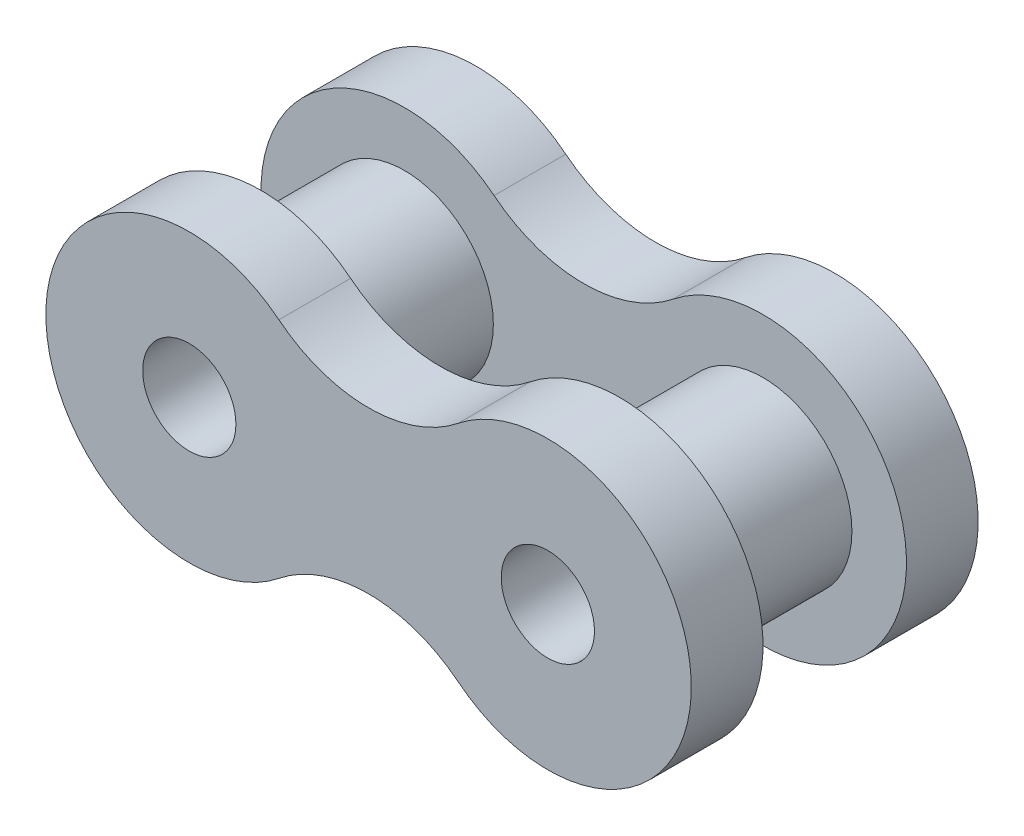
ISO-10303-21;
HEADER;
FILE_DESCRIPTION(('STEP AP214'),'2;1');
FILE_NAME('part.step','',(''),(''),'','','');
FILE_SCHEMA(('AUTOMOTIVE_DESIGN { 1 0 10303 214 1 1 1 1 }'));
ENDSEC;
DATA;
#1=APPLICATION_CONTEXT('core data for automotive mechanical design processes');
#2=APPLICATION_PROTOCOL_DEFINITION('international standard','automotive_design',2000,#1);
#3=PRODUCT_CONTEXT('',#1,'mechanical');
#4=PRODUCT('Part','Part','',(#3));
#5=PRODUCT_RELATED_PRODUCT_CATEGORY('part','',(#4));
#6=PRODUCT_DEFINITION_FORMATION('','',#4);
#7=PRODUCT_DEFINITION_CONTEXT('part definition',#1,'design');
#8=PRODUCT_DEFINITION('design','',#6,#7);
#9=PRODUCT_DEFINITION_SHAPE('','',#8);
#10=(LENGTH_UNIT() NAMED_UNIT(*) SI_UNIT(.MILLI.,.METRE.));
#11=(NAMED_UNIT(*) PLANE_ANGLE_UNIT() SI_UNIT($,.RADIAN.));
#12=(NAMED_UNIT(*) SI_UNIT($,.STERADIAN.) SOLID_ANGLE_UNIT());
#13=UNCERTAINTY_MEASURE_WITH_UNIT(LENGTH_MEASURE(1.E-05),#10,'distance_accuracy_value','');
#14=(GEOMETRIC_REPRESENTATION_CONTEXT(3) GLOBAL_UNCERTAINTY_ASSIGNED_CONTEXT((#13)) GLOBAL_UNIT_ASSIGNED_CONTEXT((#10,
#11,#12)) REPRESENTATION_CONTEXT('',''));
#15=CARTESIAN_POINT('',(0.,0.,0.));
#16=DIRECTION('',(0.,0.,1.));
#17=DIRECTION('',(1.,0.,0.));
#18=AXIS2_PLACEMENT_3D('',#15,#16,#17);
#19=CARTESIAN_POINT('',(3.175,0.,1.27));
#20=DIRECTION('',(0.,0.,-1.));
#21=DIRECTION('',(-1.,0.,0.));
#22=AXIS2_PLACEMENT_3D('',#19,#20,#21);
#23=CYLINDRICAL_SURFACE('',#22,1.5748);
#24=CARTESIAN_POINT('',(3.175,0.,1.27));
#25=DIRECTION('',(0.,0.,1.));
#26=DIRECTION('',(1.,0.,0.));
#27=AXIS2_PLACEMENT_3D('',#24,#25,#26);
#28=CIRCLE('',#27,1.5748);
#29=CARTESIAN_POINT('',(4.7498,0.,1.27));
#30=VERTEX_POINT('',#29);
#31=EDGE_CURVE('E48',#30,#30,#28,.T.);
#32=ORIENTED_EDGE('',*,*,#31,.F.);
#33=EDGE_LOOP('',(#32));
#34=FACE_BOUND('',#33,.T.);
#35=CARTESIAN_POINT('',(3.175,0.,-1.27));
#36=DIRECTION('',(0.,0.,1.));
#37=DIRECTION('',(1.,0.,0.));
#38=AXIS2_PLACEMENT_3D('',#35,#36,#37);
#39=CIRCLE('',#38,1.5748);
#40=CARTESIAN_POINT('',(4.7498,0.,-1.27));
#41=VERTEX_POINT('',#40);
#42=EDGE_CURVE('E175',#41,#41,#39,.T.);
#43=ORIENTED_EDGE('',*,*,#42,.T.);
#44=EDGE_LOOP('',(#43));
#45=FACE_BOUND('',#44,.T.);
#46=ADVANCED_FACE('F39',(#34,#45),#23,.T.);
#47=CARTESIAN_POINT('',(0.,3.96557372898298,2.54));
#48=DIRECTION('',(0.,0.,-1.));
#49=DIRECTION('',(-1.,0.,0.));
#50=AXIS2_PLACEMENT_3D('',#47,#48,#49);
#51=CYLINDRICAL_SURFACE('',#50,2.54);
#52=CARTESIAN_POINT('',(0.,3.96557372898298,1.27));
#53=DIRECTION('',(0.,0.,-1.));
#54=DIRECTION('',(1.,0.,0.));
#55=AXIS2_PLACEMENT_3D('',#52,#53,#54);
#56=CIRCLE('',#55,2.54);
#57=CARTESIAN_POINT('',(1.5875,1.98278686449149,1.27));
#58=VERTEX_POINT('',#57);
#59=CARTESIAN_POINT('',(-1.5875,1.98278686449149,1.27));
#60=VERTEX_POINT('',#59);
#61=EDGE_CURVE('E187',#58,#60,#56,.T.);
#62=ORIENTED_EDGE('',*,*,#61,.T.);
#63=DIRECTION('',(0.,0.,-1.));
#64=VECTOR('',#63,1.);
#65=CARTESIAN_POINT('',(-1.5875,1.98278686449149,2.54));
#66=LINE('',#65,#64);
#67=CARTESIAN_POINT('',(-1.5875,1.98278686449149,2.54));
#68=VERTEX_POINT('',#67);
#69=EDGE_CURVE('E206',#68,#60,#66,.T.);
#70=ORIENTED_EDGE('',*,*,#69,.F.);
#71=CARTESIAN_POINT('',(0.,3.96557372898298,2.54));
#72=DIRECTION('',(0.,0.,-1.));
#73=DIRECTION('',(1.,0.,0.));
#74=AXIS2_PLACEMENT_3D('',#71,#72,#73);
#75=CIRCLE('',#74,2.54);
#76=CARTESIAN_POINT('',(1.5875,1.98278686449149,2.54));
#77=VERTEX_POINT('',#76);
#78=EDGE_CURVE('E176',#77,#68,#75,.T.);
#79=ORIENTED_EDGE('',*,*,#78,.F.);
#80=DIRECTION('',(0.,0.,-1.));
#81=VECTOR('',#80,1.);
#82=CARTESIAN_POINT('',(1.5875,1.98278686449149,2.54));
#83=LINE('',#82,#81);
#84=EDGE_CURVE('E186',#77,#58,#83,.T.);
#85=ORIENTED_EDGE('',*,*,#84,.T.);
#86=EDGE_LOOP('',(#62,#70,#79,#85));
#87=FACE_BOUND('',#86,.T.);
#88=ADVANCED_FACE('F238',(#87),#51,.F.);
#89=CARTESIAN_POINT('',(-3.175,0.,2.54));
#90=DIRECTION('',(0.,0.,-1.));
#91=DIRECTION('',(-1.,0.,0.));
#92=AXIS2_PLACEMENT_3D('',#89,#90,#91);
#93=CYLINDRICAL_SURFACE('',#92,2.54);
#94=CARTESIAN_POINT('',(-3.175,0.,1.27));
#95=DIRECTION('',(0.,0.,1.));
#96=DIRECTION('',(1.,0.,0.));
#97=AXIS2_PLACEMENT_3D('',#94,#95,#96);
#98=CIRCLE('',#97,2.54);
#99=CARTESIAN_POINT('',(-1.5875,-1.98278686449149,1.27));
#100=VERTEX_POINT('',#99);
#101=EDGE_CURVE('E191',#60,#100,#98,.T.);
#102=ORIENTED_EDGE('',*,*,#101,.T.);
#103=DIRECTION('',(0.,0.,-1.));
#104=VECTOR('',#103,1.);
#105=CARTESIAN_POINT('',(-1.5875,-1.98278686449149,2.54));
#106=LINE('',#105,#104);
#107=CARTESIAN_POINT('',(-1.5875,-1.98278686449149,2.54));
#108=VERTEX_POINT('',#107);
#109=EDGE_CURVE('E203',#108,#100,#106,.T.);
#110=ORIENTED_EDGE('',*,*,#109,.F.);
#111=CARTESIAN_POINT('',(-3.175,0.,2.54));
#112=DIRECTION('',(0.,0.,1.));
#113=DIRECTION('',(1.,0.,0.));
#114=AXIS2_PLACEMENT_3D('',#111,#112,#113);
#115=CIRCLE('',#114,2.54);
#116=EDGE_CURVE('E88',#68,#108,#115,.T.);
#117=ORIENTED_EDGE('',*,*,#116,.F.);
#118=ORIENTED_EDGE('',*,*,#69,.T.);
#119=EDGE_LOOP('',(#102,#110,#117,#118));
#120=FACE_BOUND('',#119,.T.);
#121=ADVANCED_FACE('F243',(#120),#93,.T.);
#122=CARTESIAN_POINT('',(0.,-3.96557372898298,2.54));
#123=DIRECTION('',(0.,0.,-1.));
#124=DIRECTION('',(-1.,0.,0.));
#125=AXIS2_PLACEMENT_3D('',#122,#123,#124);
#126=CYLINDRICAL_SURFACE('',#125,2.54);
#127=CARTESIAN_POINT('',(0.,-3.96557372898298,1.27));
#128=DIRECTION('',(0.,0.,-1.));
#129=DIRECTION('',(1.,0.,0.));
#130=AXIS2_PLACEMENT_3D('',#127,#128,#129);
#131=CIRCLE('',#130,2.54);
#132=CARTESIAN_POINT('',(1.5875,-1.98278686449149,1.27));
#133=VERTEX_POINT('',#132);
#134=EDGE_CURVE('E74',#100,#133,#131,.T.);
#135=ORIENTED_EDGE('',*,*,#134,.T.);
#136=DIRECTION('',(0.,0.,-1.));
#137=VECTOR('',#136,1.);
#138=CARTESIAN_POINT('',(1.5875,-1.98278686449149,2.54));
#139=LINE('',#138,#137);
#140=CARTESIAN_POINT('',(1.5875,-1.98278686449149,2.54));
#141=VERTEX_POINT('',#140);
#142=EDGE_CURVE('E200',#141,#133,#139,.T.);
#143=ORIENTED_EDGE('',*,*,#142,.F.);
#144=CARTESIAN_POINT('',(0.,-3.96557372898298,2.54));
#145=DIRECTION('',(0.,0.,-1.));
#146=DIRECTION('',(1.,0.,0.));
#147=AXIS2_PLACEMENT_3D('',#144,#145,#146);
#148=CIRCLE('',#147,2.54);
#149=EDGE_CURVE('E181',#108,#141,#148,.T.);
#150=ORIENTED_EDGE('',*,*,#149,.F.);
#151=ORIENTED_EDGE('',*,*,#109,.T.);
#152=EDGE_LOOP('',(#135,#143,#150,#151));
#153=FACE_BOUND('',#152,.T.);
#154=ADVANCED_FACE('F259',(#153),#126,.F.);
#155=CARTESIAN_POINT('',(3.175,0.,2.54));
#156=DIRECTION('',(0.,0.,-1.));
#157=DIRECTION('',(-1.,0.,0.));
#158=AXIS2_PLACEMENT_3D('',#155,#156,#157);
#159=CYLINDRICAL_SURFACE('',#158,2.54);
#160=CARTESIAN_POINT('',(3.175,0.,1.27));
#161=DIRECTION('',(0.,0.,1.));
#162=DIRECTION('',(1.,0.,0.));
#163=AXIS2_PLACEMENT_3D('',#160,#161,#162);
#164=CIRCLE('',#163,2.54);
#165=EDGE_CURVE('E80',#133,#58,#164,.T.);
#166=ORIENTED_EDGE('',*,*,#165,.T.);
#167=ORIENTED_EDGE('',*,*,#84,.F.);
#168=CARTESIAN_POINT('',(3.175,0.,2.54));
#169=DIRECTION('',(0.,0.,1.));
#170=DIRECTION('',(1.,0.,0.));
#171=AXIS2_PLACEMENT_3D('',#168,#169,#170);
#172=CIRCLE('',#171,2.54);
#173=EDGE_CURVE('E56',#141,#77,#172,.T.);
#174=ORIENTED_EDGE('',*,*,#173,.F.);
#175=ORIENTED_EDGE('',*,*,#142,.T.);
#176=EDGE_LOOP('',(#166,#167,#174,#175));
#177=FACE_BOUND('',#176,.T.);
#178=ADVANCED_FACE('F257',(#177),#159,.T.);
#179=CARTESIAN_POINT('',(1.5875,1.98278686449149,2.54));
#180=DIRECTION('',(0.,0.,1.));
#181=DIRECTION('',(1.,0.,0.));
#182=AXIS2_PLACEMENT_3D('',#179,#180,#181);
#183=PLANE('',#182);
#184=CARTESIAN_POINT('',(3.175,0.,2.54));
#185=DIRECTION('',(0.,0.,1.));
#186=DIRECTION('',(1.,0.,0.));
#187=AXIS2_PLACEMENT_3D('',#184,#185,#186);
#188=CIRCLE('',#187,0.8255);
#189=CARTESIAN_POINT('',(4.0005,0.,2.54));
#190=VERTEX_POINT('',#189);
#191=EDGE_CURVE('E343',#190,#190,#188,.T.);
#192=ORIENTED_EDGE('',*,*,#191,.F.);
#193=EDGE_LOOP('',(#192));
#194=FACE_BOUND('',#193,.T.);
#195=CARTESIAN_POINT('',(-3.175,0.,2.54));
#196=DIRECTION('',(0.,0.,1.));
#197=DIRECTION('',(-1.,0.,0.));
#198=AXIS2_PLACEMENT_3D('',#195,#196,#197);
#199=CIRCLE('',#198,0.825499999999999);
#200=CARTESIAN_POINT('',(-2.3495,0.,2.54));
#201=VERTEX_POINT('',#200);
#202=EDGE_CURVE('E352',#201,#201,#199,.T.);
#203=ORIENTED_EDGE('',*,*,#202,.F.);
#204=EDGE_LOOP('',(#203));
#205=FACE_BOUND('',#204,.T.);
#206=ORIENTED_EDGE('',*,*,#78,.T.);
#207=ORIENTED_EDGE('',*,*,#116,.T.);
#208=ORIENTED_EDGE('',*,*,#149,.T.);
#209=ORIENTED_EDGE('',*,*,#173,.T.);
#210=EDGE_LOOP('',(#206,#207,#208,#209));
#211=FACE_BOUND('',#210,.T.);
#212=ADVANCED_FACE('F251',(#194,#205,#211),#183,.T.);
#213=CARTESIAN_POINT('',(1.5875,1.98278686449149,1.27));
#214=DIRECTION('',(0.,0.,1.));
#215=DIRECTION('',(1.,0.,0.));
#216=AXIS2_PLACEMENT_3D('',#213,#214,#215);
#217=PLANE('',#216);
#218=CARTESIAN_POINT('',(-3.175,0.,1.27));
#219=DIRECTION('',(0.,0.,1.));
#220=DIRECTION('',(1.,0.,0.));
#221=AXIS2_PLACEMENT_3D('',#218,#219,#220);
#222=CIRCLE('',#221,1.5748);
#223=CARTESIAN_POINT('',(-1.6002,0.,1.27));
#224=VERTEX_POINT('',#223);
#225=EDGE_CURVE('E11',#224,#224,#222,.F.);
#226=ORIENTED_EDGE('',*,*,#225,.F.);
#227=EDGE_LOOP('',(#226));
#228=FACE_BOUND('',#227,.T.);
#229=ORIENTED_EDGE('',*,*,#31,.T.);
#230=EDGE_LOOP('',(#229));
#231=FACE_BOUND('',#230,.T.);
#232=ORIENTED_EDGE('',*,*,#61,.F.);
#233=ORIENTED_EDGE('',*,*,#165,.F.);
#234=ORIENTED_EDGE('',*,*,#134,.F.);
#235=ORIENTED_EDGE('',*,*,#101,.F.);
#236=EDGE_LOOP('',(#232,#233,#234,#235));
#237=FACE_BOUND('',#236,.T.);
#238=ADVANCED_FACE('F247',(#228,#231,#237),#217,.F.);
#239=CARTESIAN_POINT('',(-3.175,0.,1.27));
#240=DIRECTION('',(0.,0.,-1.));
#241=DIRECTION('',(-1.,0.,0.));
#242=AXIS2_PLACEMENT_3D('',#239,#240,#241);
#243=CYLINDRICAL_SURFACE('',#242,1.5748);
#244=ORIENTED_EDGE('',*,*,#225,.T.);
#245=EDGE_LOOP('',(#244));
#246=FACE_BOUND('',#245,.T.);
#247=CARTESIAN_POINT('',(-3.175,0.,-1.27));
#248=DIRECTION('',(0.,0.,1.));
#249=DIRECTION('',(1.,0.,0.));
#250=AXIS2_PLACEMENT_3D('',#247,#248,#249);
#251=CIRCLE('',#250,1.5748);
#252=CARTESIAN_POINT('',(-1.6002,0.,-1.27));
#253=VERTEX_POINT('',#252);
#254=EDGE_CURVE('E127',#253,#253,#251,.T.);
#255=ORIENTED_EDGE('',*,*,#254,.T.);
#256=EDGE_LOOP('',(#255));
#257=FACE_BOUND('',#256,.T.);
#258=ADVANCED_FACE('F250',(#246,#257),#243,.T.);
#259=CARTESIAN_POINT('',(0.,3.96557372898298,-2.54));
#260=DIRECTION('',(0.,0.,1.));
#261=DIRECTION('',(1.,0.,0.));
#262=AXIS2_PLACEMENT_3D('',#259,#260,#261);
#263=CYLINDRICAL_SURFACE('',#262,2.54);
#264=CARTESIAN_POINT('',(0.,3.96557372898298,-1.27));
#265=DIRECTION('',(0.,0.,-1.));
#266=DIRECTION('',(1.,0.,0.));
#267=AXIS2_PLACEMENT_3D('',#264,#265,#266);
#268=CIRCLE('',#267,2.54);
#269=CARTESIAN_POINT('',(1.5875,1.98278686449149,-1.27));
#270=VERTEX_POINT('',#269);
#271=CARTESIAN_POINT('',(-1.5875,1.98278686449149,-1.27));
#272=VERTEX_POINT('',#271);
#273=EDGE_CURVE('E121',#270,#272,#268,.T.);
#274=ORIENTED_EDGE('',*,*,#273,.F.);
#275=DIRECTION('',(0.,0.,1.));
#276=VECTOR('',#275,1.);
#277=CARTESIAN_POINT('',(1.5875,1.98278686449149,-2.54));
#278=LINE('',#277,#276);
#279=CARTESIAN_POINT('',(1.5875,1.98278686449149,-2.54));
#280=VERTEX_POINT('',#279);
#281=EDGE_CURVE('E115',#280,#270,#278,.T.);
#282=ORIENTED_EDGE('',*,*,#281,.F.);
#283=CARTESIAN_POINT('',(0.,3.96557372898298,-2.54));
#284=DIRECTION('',(0.,0.,-1.));
#285=DIRECTION('',(1.,0.,0.));
#286=AXIS2_PLACEMENT_3D('',#283,#284,#285);
#287=CIRCLE('',#286,2.54);
#288=CARTESIAN_POINT('',(-1.5875,1.98278686449149,-2.54));
#289=VERTEX_POINT('',#288);
#290=EDGE_CURVE('E118',#280,#289,#287,.T.);
#291=ORIENTED_EDGE('',*,*,#290,.T.);
#292=DIRECTION('',(0.,0.,1.));
#293=VECTOR('',#292,1.);
#294=CARTESIAN_POINT('',(-1.5875,1.98278686449149,-2.54));
#295=LINE('',#294,#293);
#296=EDGE_CURVE('E151',#289,#272,#295,.T.);
#297=ORIENTED_EDGE('',*,*,#296,.T.);
#298=EDGE_LOOP('',(#274,#282,#291,#297));
#299=FACE_BOUND('',#298,.T.);
#300=ADVANCED_FACE('F117',(#299),#263,.F.);
#301=CARTESIAN_POINT('',(3.175,0.,-2.54));
#302=DIRECTION('',(0.,0.,1.));
#303=DIRECTION('',(1.,0.,0.));
#304=AXIS2_PLACEMENT_3D('',#301,#302,#303);
#305=CYLINDRICAL_SURFACE('',#304,2.54);
#306=CARTESIAN_POINT('',(3.175,0.,-1.27));
#307=DIRECTION('',(0.,0.,1.));
#308=DIRECTION('',(1.,0.,0.));
#309=AXIS2_PLACEMENT_3D('',#306,#307,#308);
#310=CIRCLE('',#309,2.54);
#311=CARTESIAN_POINT('',(1.5875,-1.98278686449149,-1.27));
#312=VERTEX_POINT('',#311);
#313=EDGE_CURVE('E154',#312,#270,#310,.T.);
#314=ORIENTED_EDGE('',*,*,#313,.F.);
#315=DIRECTION('',(0.,0.,1.));
#316=VECTOR('',#315,1.);
#317=CARTESIAN_POINT('',(1.5875,-1.98278686449149,-2.54));
#318=LINE('',#317,#316);
#319=CARTESIAN_POINT('',(1.5875,-1.98278686449149,-2.54));
#320=VERTEX_POINT('',#319);
#321=EDGE_CURVE('E128',#320,#312,#318,.T.);
#322=ORIENTED_EDGE('',*,*,#321,.F.);
#323=CARTESIAN_POINT('',(3.175,0.,-2.54));
#324=DIRECTION('',(0.,0.,1.));
#325=DIRECTION('',(1.,0.,0.));
#326=AXIS2_PLACEMENT_3D('',#323,#324,#325);
#327=CIRCLE('',#326,2.54);
#328=EDGE_CURVE('E134',#320,#280,#327,.T.);
#329=ORIENTED_EDGE('',*,*,#328,.T.);
#330=ORIENTED_EDGE('',*,*,#281,.T.);
#331=EDGE_LOOP('',(#314,#322,#329,#330));
#332=FACE_BOUND('',#331,.T.);
#333=ADVANCED_FACE('F141',(#332),#305,.T.);
#334=CARTESIAN_POINT('',(0.,-3.96557372898298,-2.54));
#335=DIRECTION('',(0.,0.,1.));
#336=DIRECTION('',(1.,0.,0.));
#337=AXIS2_PLACEMENT_3D('',#334,#335,#336);
#338=CYLINDRICAL_SURFACE('',#337,2.54);
#339=CARTESIAN_POINT('',(0.,-3.96557372898298,-1.27));
#340=DIRECTION('',(0.,0.,-1.));
#341=DIRECTION('',(1.,0.,0.));
#342=AXIS2_PLACEMENT_3D('',#339,#340,#341);
#343=CIRCLE('',#342,2.54);
#344=CARTESIAN_POINT('',(-1.5875,-1.98278686449149,-1.27));
#345=VERTEX_POINT('',#344);
#346=EDGE_CURVE('E158',#345,#312,#343,.T.);
#347=ORIENTED_EDGE('',*,*,#346,.F.);
#348=DIRECTION('',(0.,0.,1.));
#349=VECTOR('',#348,1.);
#350=CARTESIAN_POINT('',(-1.5875,-1.98278686449149,-2.54));
#351=LINE('',#350,#349);
#352=CARTESIAN_POINT('',(-1.5875,-1.98278686449149,-2.54));
#353=VERTEX_POINT('',#352);
#354=EDGE_CURVE('E167',#353,#345,#351,.T.);
#355=ORIENTED_EDGE('',*,*,#354,.F.);
#356=CARTESIAN_POINT('',(0.,-3.96557372898298,-2.54));
#357=DIRECTION('',(0.,0.,-1.));
#358=DIRECTION('',(1.,0.,0.));
#359=AXIS2_PLACEMENT_3D('',#356,#357,#358);
#360=CIRCLE('',#359,2.54);
#361=EDGE_CURVE('E143',#353,#320,#360,.T.);
#362=ORIENTED_EDGE('',*,*,#361,.T.);
#363=ORIENTED_EDGE('',*,*,#321,.T.);
#364=EDGE_LOOP('',(#347,#355,#362,#363));
#365=FACE_BOUND('',#364,.T.);
#366=ADVANCED_FACE('F228',(#365),#338,.F.);
#367=CARTESIAN_POINT('',(-3.175,0.,-2.54));
#368=DIRECTION('',(0.,0.,1.));
#369=DIRECTION('',(1.,0.,0.));
#370=AXIS2_PLACEMENT_3D('',#367,#368,#369);
#371=CYLINDRICAL_SURFACE('',#370,2.54);
#372=CARTESIAN_POINT('',(-3.175,0.,-1.27));
#373=DIRECTION('',(0.,0.,1.));
#374=DIRECTION('',(1.,0.,0.));
#375=AXIS2_PLACEMENT_3D('',#372,#373,#374);
#376=CIRCLE('',#375,2.54);
#377=EDGE_CURVE('E139',#272,#345,#376,.T.);
#378=ORIENTED_EDGE('',*,*,#377,.F.);
#379=ORIENTED_EDGE('',*,*,#296,.F.);
#380=CARTESIAN_POINT('',(-3.175,0.,-2.54));
#381=DIRECTION('',(0.,0.,1.));
#382=DIRECTION('',(1.,0.,0.));
#383=AXIS2_PLACEMENT_3D('',#380,#381,#382);
#384=CIRCLE('',#383,2.54);
#385=EDGE_CURVE('E137',#289,#353,#384,.T.);
#386=ORIENTED_EDGE('',*,*,#385,.T.);
#387=ORIENTED_EDGE('',*,*,#354,.T.);
#388=EDGE_LOOP('',(#378,#379,#386,#387));
#389=FACE_BOUND('',#388,.T.);
#390=ADVANCED_FACE('F225',(#389),#371,.T.);
#391=CARTESIAN_POINT('',(1.5875,1.98278686449149,-2.54));
#392=DIRECTION('',(0.,0.,-1.));
#393=DIRECTION('',(1.,0.,0.));
#394=AXIS2_PLACEMENT_3D('',#391,#392,#393);
#395=PLANE('',#394);
#396=CARTESIAN_POINT('',(3.175,0.,-2.54));
#397=DIRECTION('',(0.,0.,-1.));
#398=DIRECTION('',(-1.,0.,0.));
#399=AXIS2_PLACEMENT_3D('',#396,#397,#398);
#400=CIRCLE('',#399,0.8255);
#401=CARTESIAN_POINT('',(4.0005,0.,-2.54));
#402=VERTEX_POINT('',#401);
#403=EDGE_CURVE('E155',#402,#402,#400,.F.);
#404=ORIENTED_EDGE('',*,*,#403,.T.);
#405=EDGE_LOOP('',(#404));
#406=FACE_BOUND('',#405,.T.);
#407=CARTESIAN_POINT('',(-3.175,0.,-2.54));
#408=DIRECTION('',(0.,0.,-1.));
#409=DIRECTION('',(-1.,0.,0.));
#410=AXIS2_PLACEMENT_3D('',#407,#408,#409);
#411=CIRCLE('',#410,0.825499999999999);
#412=CARTESIAN_POINT('',(-2.3495,0.,-2.54));
#413=VERTEX_POINT('',#412);
#414=EDGE_CURVE('E349',#413,#413,#411,.F.);
#415=ORIENTED_EDGE('',*,*,#414,.T.);
#416=EDGE_LOOP('',(#415));
#417=FACE_BOUND('',#416,.T.);
#418=ORIENTED_EDGE('',*,*,#290,.F.);
#419=ORIENTED_EDGE('',*,*,#328,.F.);
#420=ORIENTED_EDGE('',*,*,#361,.F.);
#421=ORIENTED_EDGE('',*,*,#385,.F.);
#422=EDGE_LOOP('',(#418,#419,#420,#421));
#423=FACE_BOUND('',#422,.T.);
#424=ADVANCED_FACE('F132',(#406,#417,#423),#395,.T.);
#425=CARTESIAN_POINT('',(1.5875,1.98278686449149,-1.27));
#426=DIRECTION('',(0.,0.,-1.));
#427=DIRECTION('',(1.,0.,0.));
#428=AXIS2_PLACEMENT_3D('',#425,#426,#427);
#429=PLANE('',#428);
#430=ORIENTED_EDGE('',*,*,#42,.F.);
#431=EDGE_LOOP('',(#430));
#432=FACE_BOUND('',#431,.T.);
#433=ORIENTED_EDGE('',*,*,#254,.F.);
#434=EDGE_LOOP('',(#433));
#435=FACE_BOUND('',#434,.T.);
#436=ORIENTED_EDGE('',*,*,#273,.T.);
#437=ORIENTED_EDGE('',*,*,#377,.T.);
#438=ORIENTED_EDGE('',*,*,#346,.T.);
#439=ORIENTED_EDGE('',*,*,#313,.T.);
#440=EDGE_LOOP('',(#436,#437,#438,#439));
#441=FACE_BOUND('',#440,.T.);
#442=ADVANCED_FACE('F216',(#432,#435,#441),#429,.F.);
#443=CARTESIAN_POINT('',(-3.175,0.,-4.87486659147798));
#444=DIRECTION('',(0.,0.,1.));
#445=DIRECTION('',(1.,0.,0.));
#446=AXIS2_PLACEMENT_3D('',#443,#444,#445);
#447=CYLINDRICAL_SURFACE('',#446,0.825499999999999);
#448=CARTESIAN_POINT('',(-2.3495,0.,2.54));
#449=CARTESIAN_POINT('',(-2.3495,0.,2.48708333333333));
#450=CARTESIAN_POINT('',(-2.3495,0.,2.43416666666667));
#451=CARTESIAN_POINT('',(-2.3495,0.,2.32833333333333));
#452=CARTESIAN_POINT('',(-2.3495,0.,2.27541666666667));
#453=CARTESIAN_POINT('',(-2.3495,0.,2.16958333333333));
#454=CARTESIAN_POINT('',(-2.3495,0.,2.11666666666667));
#455=CARTESIAN_POINT('',(-2.3495,0.,2.01083333333333));
#456=CARTESIAN_POINT('',(-2.3495,0.,1.95791666666667));
#457=CARTESIAN_POINT('',(-2.3495,0.,1.85208333333333));
#458=CARTESIAN_POINT('',(-2.3495,0.,1.79916666666667));
#459=CARTESIAN_POINT('',(-2.3495,0.,1.69333333333333));
#460=CARTESIAN_POINT('',(-2.3495,0.,1.64041666666667));
#461=CARTESIAN_POINT('',(-2.3495,0.,1.53458333333333));
#462=CARTESIAN_POINT('',(-2.3495,0.,1.48166666666667));
#463=CARTESIAN_POINT('',(-2.3495,0.,1.37583333333333));
#464=CARTESIAN_POINT('',(-2.3495,0.,1.32291666666667));
#465=CARTESIAN_POINT('',(-2.3495,0.,1.21708333333333));
#466=CARTESIAN_POINT('',(-2.3495,0.,1.16416666666667));
#467=CARTESIAN_POINT('',(-2.3495,0.,1.05833333333333));
#468=CARTESIAN_POINT('',(-2.3495,0.,1.00541666666667));
#469=CARTESIAN_POINT('',(-2.3495,0.,0.899583333333333));
#470=CARTESIAN_POINT('',(-2.3495,0.,0.846666666666666));
#471=CARTESIAN_POINT('',(-2.3495,0.,0.740833333333333));
#472=CARTESIAN_POINT('',(-2.3495,0.,0.687916666666666));
#473=CARTESIAN_POINT('',(-2.3495,0.,0.582083333333333));
#474=CARTESIAN_POINT('',(-2.3495,0.,0.529166666666666));
#475=CARTESIAN_POINT('',(-2.3495,0.,0.423333333333333));
#476=CARTESIAN_POINT('',(-2.3495,0.,0.370416666666666));
#477=CARTESIAN_POINT('',(-2.3495,0.,0.264583333333333));
#478=CARTESIAN_POINT('',(-2.3495,0.,0.211666666666666));
#479=CARTESIAN_POINT('',(-2.3495,0.,0.105833333333333));
#480=CARTESIAN_POINT('',(-2.3495,0.,0.0529166666666661));
#481=CARTESIAN_POINT('',(-2.3495,0.,-0.0529166666666673));
#482=CARTESIAN_POINT('',(-2.3495,0.,-0.105833333333334));
#483=CARTESIAN_POINT('',(-2.3495,0.,-0.211666666666667));
#484=CARTESIAN_POINT('',(-2.3495,0.,-0.264583333333334));
#485=CARTESIAN_POINT('',(-2.3495,0.,-0.370416666666667));
#486=CARTESIAN_POINT('',(-2.3495,0.,-0.423333333333334));
#487=CARTESIAN_POINT('',(-2.3495,0.,-0.529166666666667));
#488=CARTESIAN_POINT('',(-2.3495,0.,-0.582083333333334));
#489=CARTESIAN_POINT('',(-2.3495,0.,-0.687916666666667));
#490=CARTESIAN_POINT('',(-2.3495,0.,-0.740833333333334));
#491=CARTESIAN_POINT('',(-2.3495,0.,-0.846666666666667));
#492=CARTESIAN_POINT('',(-2.3495,0.,-0.899583333333334));
#493=CARTESIAN_POINT('',(-2.3495,0.,-1.00541666666667));
#494=CARTESIAN_POINT('',(-2.3495,0.,-1.05833333333333));
#495=CARTESIAN_POINT('',(-2.3495,0.,-1.16416666666667));
#496=CARTESIAN_POINT('',(-2.3495,0.,-1.21708333333333));
#497=CARTESIAN_POINT('',(-2.3495,0.,-1.32291666666667));
#498=CARTESIAN_POINT('',(-2.3495,0.,-1.37583333333333));
#499=CARTESIAN_POINT('',(-2.3495,0.,-1.48166666666667));
#500=CARTESIAN_POINT('',(-2.3495,0.,-1.53458333333333));
#501=CARTESIAN_POINT('',(-2.3495,0.,-1.64041666666667));
#502=CARTESIAN_POINT('',(-2.3495,0.,-1.69333333333333));
#503=CARTESIAN_POINT('',(-2.3495,0.,-1.79916666666667));
#504=CARTESIAN_POINT('',(-2.3495,0.,-1.85208333333333));
#505=CARTESIAN_POINT('',(-2.3495,0.,-1.95791666666667));
#506=CARTESIAN_POINT('',(-2.3495,0.,-2.01083333333333));
#507=CARTESIAN_POINT('',(-2.3495,0.,-2.11666666666667));
#508=CARTESIAN_POINT('',(-2.3495,0.,-2.16958333333333));
#509=CARTESIAN_POINT('',(-2.3495,0.,-2.27541666666667));
#510=CARTESIAN_POINT('',(-2.3495,0.,-2.32833333333333));
#511=CARTESIAN_POINT('',(-2.3495,0.,-2.43416666666667));
#512=CARTESIAN_POINT('',(-2.3495,0.,-2.48708333333333));
#513=CARTESIAN_POINT('',(-2.3495,0.,-2.54));
#514=B_SPLINE_CURVE_WITH_KNOTS('',3,(#448,#449,#450,#451,#452,#453,#454,#455,#456,#457,#458,
#459,#460,#461,#462,#463,#464,#465,#466,#467,#468,#469,#470,#471,#472,#473,#474,#475,#476,#477,
#478,#479,#480,#481,#482,#483,#484,#485,#486,#487,#488,#489,#490,#491,#492,#493,#494,#495,#496,
#497,#498,#499,#500,#501,#502,#503,#504,#505,#506,#507,#508,#509,#510,#511,#512,#513),
.UNSPECIFIED.,.F.,.F.,(4,2,2,2,2,2,2,2,2,2,2,2,2,2,2,2,2,2,2,2,2,2,2,2,2,2,2,2,2,2,2,2,4),(0.,
0.15875,0.3175,0.47625,0.635,0.79375,0.9525,1.11125,1.27,1.42875,1.5875,1.74625,1.905,2.06375,
2.2225,2.38125,2.54,2.69875,2.8575,3.01625,3.175,3.33375,3.4925,3.65125,3.81,3.96875,4.1275,
4.28625,4.445,4.60375,4.7625,4.92125,5.08),.UNSPECIFIED.);
#515=EDGE_CURVE('BSEAM219',#201,#413,#514,.T.);
#516=ORIENTED_EDGE('',*,*,#202,.T.);
#517=ORIENTED_EDGE('',*,*,#414,.F.);
#518=ORIENTED_EDGE('',*,*,#515,.T.);
#519=ORIENTED_EDGE('',*,*,#515,.F.);
#520=EDGE_LOOP('',(#516,#518,#517,#519));
#521=FACE_BOUND('',#520,.T.);
#522=ADVANCED_FACE('F219',(#521),#447,.F.);
#523=CARTESIAN_POINT('',(3.175,0.,-4.87486659147798));
#524=DIRECTION('',(0.,0.,1.));
#525=DIRECTION('',(1.,0.,0.));
#526=AXIS2_PLACEMENT_3D('',#523,#524,#525);
#527=CYLINDRICAL_SURFACE('',#526,0.8255);
#528=CARTESIAN_POINT('',(4.0005,0.,2.54));
#529=CARTESIAN_POINT('',(4.0005,0.,2.48708333333333));
#530=CARTESIAN_POINT('',(4.0005,0.,2.43416666666667));
#531=CARTESIAN_POINT('',(4.0005,0.,2.32833333333333));
#532=CARTESIAN_POINT('',(4.0005,0.,2.27541666666667));
#533=CARTESIAN_POINT('',(4.0005,0.,2.16958333333333));
#534=CARTESIAN_POINT('',(4.0005,0.,2.11666666666667));
#535=CARTESIAN_POINT('',(4.0005,0.,2.01083333333333));
#536=CARTESIAN_POINT('',(4.0005,0.,1.95791666666667));
#537=CARTESIAN_POINT('',(4.0005,0.,1.85208333333333));
#538=CARTESIAN_POINT('',(4.0005,0.,1.79916666666667));
#539=CARTESIAN_POINT('',(4.0005,0.,1.69333333333333));
#540=CARTESIAN_POINT('',(4.0005,0.,1.64041666666667));
#541=CARTESIAN_POINT('',(4.0005,0.,1.53458333333333));
#542=CARTESIAN_POINT('',(4.0005,0.,1.48166666666667));
#543=CARTESIAN_POINT('',(4.0005,0.,1.37583333333333));
#544=CARTESIAN_POINT('',(4.0005,0.,1.32291666666667));
#545=CARTESIAN_POINT('',(4.0005,0.,1.21708333333333));
#546=CARTESIAN_POINT('',(4.0005,0.,1.16416666666667));
#547=CARTESIAN_POINT('',(4.0005,0.,1.05833333333333));
#548=CARTESIAN_POINT('',(4.0005,0.,1.00541666666667));
#549=CARTESIAN_POINT('',(4.0005,0.,0.899583333333333));
#550=CARTESIAN_POINT('',(4.0005,0.,0.846666666666666));
#551=CARTESIAN_POINT('',(4.0005,0.,0.740833333333333));
#552=CARTESIAN_POINT('',(4.0005,0.,0.687916666666666));
#553=CARTESIAN_POINT('',(4.0005,0.,0.582083333333333));
#554=CARTESIAN_POINT('',(4.0005,0.,0.529166666666666));
#555=CARTESIAN_POINT('',(4.0005,0.,0.423333333333333));
#556=CARTESIAN_POINT('',(4.0005,0.,0.370416666666666));
#557=CARTESIAN_POINT('',(4.0005,0.,0.264583333333333));
#558=CARTESIAN_POINT('',(4.0005,0.,0.211666666666666));
#559=CARTESIAN_POINT('',(4.0005,0.,0.105833333333333));
#560=CARTESIAN_POINT('',(4.0005,0.,0.0529166666666661));
#561=CARTESIAN_POINT('',(4.0005,0.,-0.0529166666666673));
#562=CARTESIAN_POINT('',(4.0005,0.,-0.105833333333334));
#563=CARTESIAN_POINT('',(4.0005,0.,-0.211666666666667));
#564=CARTESIAN_POINT('',(4.0005,0.,-0.264583333333334));
#565=CARTESIAN_POINT('',(4.0005,0.,-0.370416666666667));
#566=CARTESIAN_POINT('',(4.0005,0.,-0.423333333333334));
#567=CARTESIAN_POINT('',(4.0005,0.,-0.529166666666667));
#568=CARTESIAN_POINT('',(4.0005,0.,-0.582083333333334));
#569=CARTESIAN_POINT('',(4.0005,0.,-0.687916666666667));
#570=CARTESIAN_POINT('',(4.0005,0.,-0.740833333333334));
#571=CARTESIAN_POINT('',(4.0005,0.,-0.846666666666667));
#572=CARTESIAN_POINT('',(4.0005,0.,-0.899583333333334));
#573=CARTESIAN_POINT('',(4.0005,0.,-1.00541666666667));
#574=CARTESIAN_POINT('',(4.0005,0.,-1.05833333333333));
#575=CARTESIAN_POINT('',(4.0005,0.,-1.16416666666667));
#576=CARTESIAN_POINT('',(4.0005,0.,-1.21708333333333));
#577=CARTESIAN_POINT('',(4.0005,0.,-1.32291666666667));
#578=CARTESIAN_POINT('',(4.0005,0.,-1.37583333333333));
#579=CARTESIAN_POINT('',(4.0005,0.,-1.48166666666667));
#580=CARTESIAN_POINT('',(4.0005,0.,-1.53458333333333));
#581=CARTESIAN_POINT('',(4.0005,0.,-1.64041666666667));
#582=CARTESIAN_POINT('',(4.0005,0.,-1.69333333333333));
#583=CARTESIAN_POINT('',(4.0005,0.,-1.79916666666667));
#584=CARTESIAN_POINT('',(4.0005,0.,-1.85208333333333));
#585=CARTESIAN_POINT('',(4.0005,0.,-1.95791666666667));
#586=CARTESIAN_POINT('',(4.0005,0.,-2.01083333333333));
#587=CARTESIAN_POINT('',(4.0005,0.,-2.11666666666667));
#588=CARTESIAN_POINT('',(4.0005,0.,-2.16958333333333));
#589=CARTESIAN_POINT('',(4.0005,0.,-2.27541666666667));
#590=CARTESIAN_POINT('',(4.0005,0.,-2.32833333333333));
#591=CARTESIAN_POINT('',(4.0005,0.,-2.43416666666667));
#592=CARTESIAN_POINT('',(4.0005,0.,-2.48708333333333));
#593=CARTESIAN_POINT('',(4.0005,0.,-2.54));
#594=B_SPLINE_CURVE_WITH_KNOTS('',3,(#528,#529,#530,#531,#532,#533,#534,#535,#536,#537,#538,
#539,#540,#541,#542,#543,#544,#545,#546,#547,#548,#549,#550,#551,#552,#553,#554,#555,#556,#557,
#558,#559,#560,#561,#562,#563,#564,#565,#566,#567,#568,#569,#570,#571,#572,#573,#574,#575,#576,
#577,#578,#579,#580,#581,#582,#583,#584,#585,#586,#587,#588,#589,#590,#591,#592,#593),
.UNSPECIFIED.,.F.,.F.,(4,2,2,2,2,2,2,2,2,2,2,2,2,2,2,2,2,2,2,2,2,2,2,2,2,2,2,2,2,2,2,2,4),(0.,
0.15875,0.3175,0.47625,0.635,0.79375,0.9525,1.11125,1.27,1.42875,1.5875,1.74625,1.905,2.06375,
2.2225,2.38125,2.54,2.69875,2.8575,3.01625,3.175,3.33375,3.4925,3.65125,3.81,3.96875,4.1275,
4.28625,4.445,4.60375,4.7625,4.92125,5.08),.UNSPECIFIED.);
#595=EDGE_CURVE('BSEAM326',#190,#402,#594,.T.);
#596=ORIENTED_EDGE('',*,*,#191,.T.);
#597=ORIENTED_EDGE('',*,*,#403,.F.);
#598=ORIENTED_EDGE('',*,*,#595,.T.);
#599=ORIENTED_EDGE('',*,*,#595,.F.);
#600=EDGE_LOOP('',(#596,#598,#597,#599));
#601=FACE_BOUND('',#600,.T.);
#602=ADVANCED_FACE('F326',(#601),#527,.F.);
#603=CLOSED_SHELL('',(#46,#88,#121,#154,#178,#212,#238,#258,#300,#333,#366,#390,#424,#442,#522,#602));
#604=MANIFOLD_SOLID_BREP('B2',#603);
#605=ADVANCED_BREP_SHAPE_REPRESENTATION('',(#18,#604),#14);
#606=SHAPE_DEFINITION_REPRESENTATION(#9,#605);
ENDSEC;
END-ISO-10303-21;
